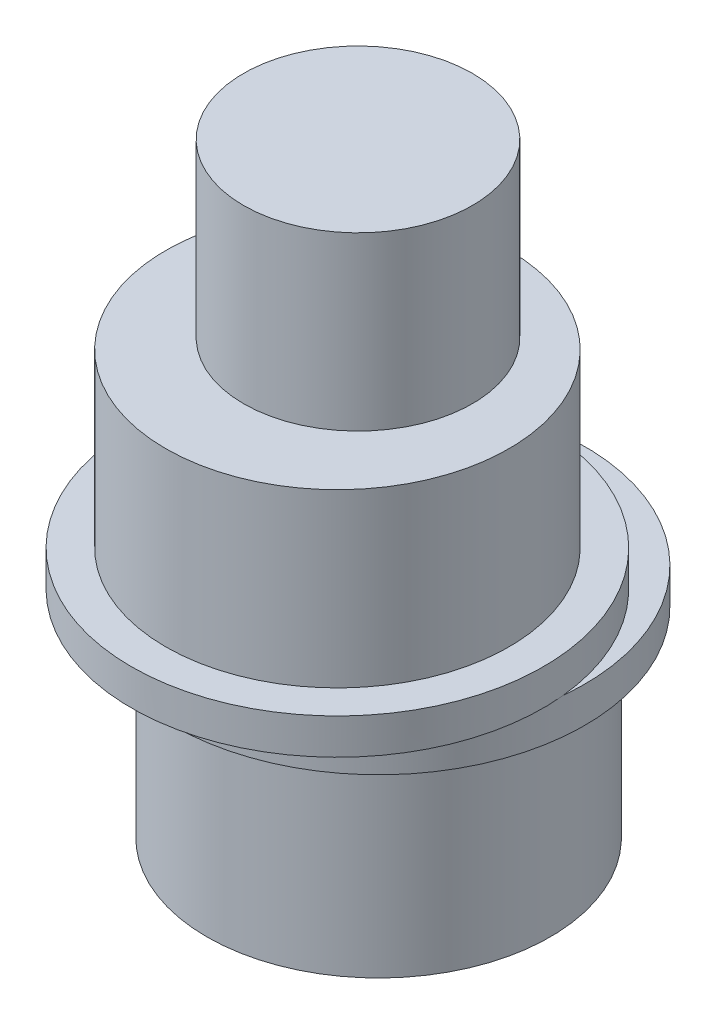
ISO-10303-21;
HEADER;
FILE_DESCRIPTION(('STEP AP214'),'2;1');
FILE_NAME('part.step','',(''),(''),'','','');
FILE_SCHEMA(('AUTOMOTIVE_DESIGN { 1 0 10303 214 1 1 1 1 }'));
ENDSEC;
DATA;
#1=APPLICATION_CONTEXT('core data for automotive mechanical design processes');
#2=APPLICATION_PROTOCOL_DEFINITION('international standard','automotive_design',2000,#1);
#3=PRODUCT_CONTEXT('',#1,'mechanical');
#4=PRODUCT('Part','Part','',(#3));
#5=PRODUCT_RELATED_PRODUCT_CATEGORY('part','',(#4));
#6=PRODUCT_DEFINITION_FORMATION('','',#4);
#7=PRODUCT_DEFINITION_CONTEXT('part definition',#1,'design');
#8=PRODUCT_DEFINITION('design','',#6,#7);
#9=PRODUCT_DEFINITION_SHAPE('','',#8);
#10=(LENGTH_UNIT() NAMED_UNIT(*) SI_UNIT(.MILLI.,.METRE.));
#11=(NAMED_UNIT(*) PLANE_ANGLE_UNIT() SI_UNIT($,.RADIAN.));
#12=(NAMED_UNIT(*) SI_UNIT($,.STERADIAN.) SOLID_ANGLE_UNIT());
#13=UNCERTAINTY_MEASURE_WITH_UNIT(LENGTH_MEASURE(1.E-05),#10,'distance_accuracy_value','');
#14=(GEOMETRIC_REPRESENTATION_CONTEXT(3) GLOBAL_UNCERTAINTY_ASSIGNED_CONTEXT((#13)) GLOBAL_UNIT_ASSIGNED_CONTEXT((#10,
#11,#12)) REPRESENTATION_CONTEXT('',''));
#15=CARTESIAN_POINT('',(0.,0.,0.));
#16=DIRECTION('',(0.,0.,1.));
#17=DIRECTION('',(1.,0.,0.));
#18=AXIS2_PLACEMENT_3D('',#15,#16,#17);
#19=CARTESIAN_POINT('',(0.,7.,-0.72));
#20=DIRECTION('',(0.,-1.,0.));
#21=DIRECTION('',(0.,0.,-1.));
#22=AXIS2_PLACEMENT_3D('',#19,#20,#21);
#23=CYLINDRICAL_SURFACE('',#22,6.);
#24=CARTESIAN_POINT('',(0.,7.,-0.72));
#25=DIRECTION('',(0.,1.,0.));
#26=DIRECTION('',(0.,0.,1.));
#27=AXIS2_PLACEMENT_3D('',#24,#25,#26);
#28=CIRCLE('',#27,6.);
#29=CARTESIAN_POINT('',(0.,7.,5.28));
#30=VERTEX_POINT('',#29);
#31=EDGE_CURVE('E108',#30,#30,#28,.T.);
#32=ORIENTED_EDGE('',*,*,#31,.F.);
#33=EDGE_LOOP('',(#32));
#34=FACE_BOUND('',#33,.T.);
#35=CARTESIAN_POINT('',(0.,0.,-0.72));
#36=DIRECTION('',(0.,1.,0.));
#37=DIRECTION('',(0.,0.,1.));
#38=AXIS2_PLACEMENT_3D('',#35,#36,#37);
#39=CIRCLE('',#38,6.);
#40=CARTESIAN_POINT('',(0.,0.,5.28));
#41=VERTEX_POINT('',#40);
#42=EDGE_CURVE('E121',#41,#41,#39,.T.);
#43=ORIENTED_EDGE('',*,*,#42,.T.);
#44=EDGE_LOOP('',(#43));
#45=FACE_BOUND('',#44,.T.);
#46=ADVANCED_FACE('F45',(#34,#45),#23,.T.);
#47=CARTESIAN_POINT('',(0.,0.,-0.72));
#48=DIRECTION('',(0.,1.,0.));
#49=DIRECTION('',(0.,0.,1.));
#50=AXIS2_PLACEMENT_3D('',#47,#48,#49);
#51=PLANE('',#50);
#52=DIRECTION('',(1.,0.,0.));
#53=VECTOR('',#52,1.);
#54=CARTESIAN_POINT('',(0.,0.,2.));
#55=LINE('',#54,#53);
#56=CARTESIAN_POINT('',(-1.5,0.,2.));
#57=VERTEX_POINT('',#56);
#58=CARTESIAN_POINT('',(1.5,0.,2.));
#59=VERTEX_POINT('',#58);
#60=EDGE_CURVE('E107',#57,#59,#55,.T.);
#61=ORIENTED_EDGE('',*,*,#60,.T.);
#62=CARTESIAN_POINT('',(0.,0.,0.));
#63=DIRECTION('',(0.,-1.,0.));
#64=DIRECTION('',(0.,0.,-1.));
#65=AXIS2_PLACEMENT_3D('',#62,#63,#64);
#66=CIRCLE('',#65,2.5);
#67=EDGE_CURVE('E48',#59,#57,#66,.F.);
#68=ORIENTED_EDGE('',*,*,#67,.T.);
#69=EDGE_LOOP('',(#61,#68));
#70=FACE_BOUND('',#69,.T.);
#71=ORIENTED_EDGE('',*,*,#42,.F.);
#72=EDGE_LOOP('',(#71));
#73=FACE_BOUND('',#72,.T.);
#74=ADVANCED_FACE('F134',(#70,#73),#51,.F.);
#75=CARTESIAN_POINT('',(0.,8.25,-0.72));
#76=DIRECTION('',(0.,-1.,0.));
#77=DIRECTION('',(0.,0.,-1.));
#78=AXIS2_PLACEMENT_3D('',#75,#76,#77);
#79=CYLINDRICAL_SURFACE('',#78,7.2);
#80=CARTESIAN_POINT('',(0.,8.25,-0.72));
#81=DIRECTION('',(0.,1.,0.));
#82=DIRECTION('',(0.,0.,1.));
#83=AXIS2_PLACEMENT_3D('',#80,#81,#82);
#84=CIRCLE('',#83,7.2);
#85=CARTESIAN_POINT('',(7.16390954716766,8.25,0.));
#86=VERTEX_POINT('',#85);
#87=CARTESIAN_POINT('',(-7.16390954716766,8.25,0.));
#88=VERTEX_POINT('',#87);
#89=EDGE_CURVE('E118',#86,#88,#84,.T.);
#90=ORIENTED_EDGE('',*,*,#89,.F.);
#91=EDGE_CURVE('E122',#88,#86,#84,.T.);
#92=ORIENTED_EDGE('',*,*,#91,.F.);
#93=EDGE_LOOP('',(#90,#92));
#94=FACE_BOUND('',#93,.T.);
#95=CARTESIAN_POINT('',(0.,7.,-0.72));
#96=DIRECTION('',(0.,1.,0.));
#97=DIRECTION('',(0.,0.,1.));
#98=AXIS2_PLACEMENT_3D('',#95,#96,#97);
#99=CIRCLE('',#98,7.2);
#100=CARTESIAN_POINT('',(0.,7.,6.48));
#101=VERTEX_POINT('',#100);
#102=EDGE_CURVE('E113',#101,#101,#99,.T.);
#103=ORIENTED_EDGE('',*,*,#102,.T.);
#104=EDGE_LOOP('',(#103));
#105=FACE_BOUND('',#104,.T.);
#106=ADVANCED_FACE('F137',(#94,#105),#79,.T.);
#107=CARTESIAN_POINT('',(0.,8.25,-0.72));
#108=DIRECTION('',(0.,1.,0.));
#109=DIRECTION('',(0.,0.,1.));
#110=AXIS2_PLACEMENT_3D('',#107,#108,#109);
#111=PLANE('',#110);
#112=CARTESIAN_POINT('',(0.,8.25,0.72));
#113=DIRECTION('',(0.,1.,0.));
#114=DIRECTION('',(0.,0.,1.));
#115=AXIS2_PLACEMENT_3D('',#112,#113,#114);
#116=CIRCLE('',#115,7.2);
#117=EDGE_CURVE('E114',#86,#88,#116,.T.);
#118=ORIENTED_EDGE('',*,*,#117,.F.);
#119=ORIENTED_EDGE('',*,*,#89,.T.);
#120=EDGE_LOOP('',(#118,#119));
#121=FACE_BOUND('',#120,.T.);
#122=ADVANCED_FACE('F150',(#121),#111,.T.);
#123=CARTESIAN_POINT('',(0.,7.,-0.72));
#124=DIRECTION('',(0.,1.,0.));
#125=DIRECTION('',(0.,0.,1.));
#126=AXIS2_PLACEMENT_3D('',#123,#124,#125);
#127=PLANE('',#126);
#128=ORIENTED_EDGE('',*,*,#31,.T.);
#129=EDGE_LOOP('',(#128));
#130=FACE_BOUND('',#129,.T.);
#131=ORIENTED_EDGE('',*,*,#102,.F.);
#132=EDGE_LOOP('',(#131));
#133=FACE_BOUND('',#132,.T.);
#134=ADVANCED_FACE('F147',(#130,#133),#127,.F.);
#135=CARTESIAN_POINT('',(0.,8.25,0.72));
#136=DIRECTION('',(0.,1.,0.));
#137=DIRECTION('',(0.,0.,1.));
#138=AXIS2_PLACEMENT_3D('',#135,#136,#137);
#139=PLANE('',#138);
#140=EDGE_CURVE('E102',#88,#86,#116,.T.);
#141=ORIENTED_EDGE('',*,*,#140,.F.);
#142=ORIENTED_EDGE('',*,*,#91,.T.);
#143=EDGE_LOOP('',(#141,#142));
#144=FACE_BOUND('',#143,.T.);
#145=ADVANCED_FACE('F149',(#144),#139,.F.);
#146=CARTESIAN_POINT('',(0.,9.5,0.72));
#147=DIRECTION('',(0.,-1.,0.));
#148=DIRECTION('',(0.,0.,-1.));
#149=AXIS2_PLACEMENT_3D('',#146,#147,#148);
#150=CYLINDRICAL_SURFACE('',#149,7.2);
#151=CARTESIAN_POINT('',(0.,9.5,0.72));
#152=DIRECTION('',(0.,1.,0.));
#153=DIRECTION('',(0.,0.,1.));
#154=AXIS2_PLACEMENT_3D('',#151,#152,#153);
#155=CIRCLE('',#154,7.2);
#156=CARTESIAN_POINT('',(0.,9.5,7.92));
#157=VERTEX_POINT('',#156);
#158=EDGE_CURVE('E109',#157,#157,#155,.T.);
#159=ORIENTED_EDGE('',*,*,#158,.F.);
#160=EDGE_LOOP('',(#159));
#161=FACE_BOUND('',#160,.T.);
#162=ORIENTED_EDGE('',*,*,#117,.T.);
#163=ORIENTED_EDGE('',*,*,#140,.T.);
#164=EDGE_LOOP('',(#162,#163));
#165=FACE_BOUND('',#164,.T.);
#166=ADVANCED_FACE('F164',(#161,#165),#150,.T.);
#167=CARTESIAN_POINT('',(0.,9.5,0.72));
#168=DIRECTION('',(0.,1.,0.));
#169=DIRECTION('',(0.,0.,1.));
#170=AXIS2_PLACEMENT_3D('',#167,#168,#169);
#171=PLANE('',#170);
#172=CARTESIAN_POINT('',(0.,9.5,0.72));
#173=DIRECTION('',(0.,1.,0.));
#174=DIRECTION('',(0.,0.,1.));
#175=AXIS2_PLACEMENT_3D('',#172,#173,#174);
#176=CIRCLE('',#175,6.);
#177=CARTESIAN_POINT('',(0.,9.5,6.72));
#178=VERTEX_POINT('',#177);
#179=EDGE_CURVE('E103',#178,#178,#176,.T.);
#180=ORIENTED_EDGE('',*,*,#179,.F.);
#181=EDGE_LOOP('',(#180));
#182=FACE_BOUND('',#181,.T.);
#183=ORIENTED_EDGE('',*,*,#158,.T.);
#184=EDGE_LOOP('',(#183));
#185=FACE_BOUND('',#184,.T.);
#186=ADVANCED_FACE('F167',(#182,#185),#171,.T.);
#187=CARTESIAN_POINT('',(0.,15.5,0.72));
#188=DIRECTION('',(0.,-1.,0.));
#189=DIRECTION('',(0.,0.,-1.));
#190=AXIS2_PLACEMENT_3D('',#187,#188,#189);
#191=CYLINDRICAL_SURFACE('',#190,6.);
#192=CARTESIAN_POINT('',(0.,15.5,0.72));
#193=DIRECTION('',(0.,1.,0.));
#194=DIRECTION('',(0.,0.,1.));
#195=AXIS2_PLACEMENT_3D('',#192,#193,#194);
#196=CIRCLE('',#195,6.);
#197=CARTESIAN_POINT('',(0.,15.5,6.72));
#198=VERTEX_POINT('',#197);
#199=EDGE_CURVE('E98',#198,#198,#196,.T.);
#200=ORIENTED_EDGE('',*,*,#199,.F.);
#201=EDGE_LOOP('',(#200));
#202=FACE_BOUND('',#201,.T.);
#203=ORIENTED_EDGE('',*,*,#179,.T.);
#204=EDGE_LOOP('',(#203));
#205=FACE_BOUND('',#204,.T.);
#206=ADVANCED_FACE('F174',(#202,#205),#191,.T.);
#207=CARTESIAN_POINT('',(0.,15.5,0.72));
#208=DIRECTION('',(0.,1.,0.));
#209=DIRECTION('',(0.,0.,1.));
#210=AXIS2_PLACEMENT_3D('',#207,#208,#209);
#211=PLANE('',#210);
#212=CARTESIAN_POINT('',(0.,15.5,0.));
#213=DIRECTION('',(0.,1.,0.));
#214=DIRECTION('',(0.,0.,1.));
#215=AXIS2_PLACEMENT_3D('',#212,#213,#214);
#216=CIRCLE('',#215,4.);
#217=CARTESIAN_POINT('',(0.,15.5,4.));
#218=VERTEX_POINT('',#217);
#219=EDGE_CURVE('E11',#218,#218,#216,.T.);
#220=ORIENTED_EDGE('',*,*,#219,.F.);
#221=EDGE_LOOP('',(#220));
#222=FACE_BOUND('',#221,.T.);
#223=ORIENTED_EDGE('',*,*,#199,.T.);
#224=EDGE_LOOP('',(#223));
#225=FACE_BOUND('',#224,.T.);
#226=ADVANCED_FACE('F178',(#222,#225),#211,.T.);
#227=CARTESIAN_POINT('',(0.,11.,0.));
#228=DIRECTION('',(0.,-1.,0.));
#229=DIRECTION('',(0.,0.,-1.));
#230=AXIS2_PLACEMENT_3D('',#227,#228,#229);
#231=CYLINDRICAL_SURFACE('',#230,2.5);
#232=DIRECTION('',(0.,-1.,0.));
#233=VECTOR('',#232,1.);
#234=CARTESIAN_POINT('',(1.5,11.,2.));
#235=LINE('',#234,#233);
#236=CARTESIAN_POINT('',(1.5,11.,2.));
#237=VERTEX_POINT('',#236);
#238=EDGE_CURVE('E62',#237,#59,#235,.T.);
#239=ORIENTED_EDGE('',*,*,#238,.F.);
#240=CARTESIAN_POINT('',(0.,11.,0.));
#241=DIRECTION('',(0.,-1.,0.));
#242=DIRECTION('',(0.,0.,-1.));
#243=AXIS2_PLACEMENT_3D('',#240,#241,#242);
#244=CIRCLE('',#243,2.5);
#245=CARTESIAN_POINT('',(-1.5,11.,2.));
#246=VERTEX_POINT('',#245);
#247=EDGE_CURVE('E79',#246,#237,#244,.T.);
#248=ORIENTED_EDGE('',*,*,#247,.F.);
#249=DIRECTION('',(0.,-1.,0.));
#250=VECTOR('',#249,1.);
#251=CARTESIAN_POINT('',(-1.5,11.,2.));
#252=LINE('',#251,#250);
#253=EDGE_CURVE('E84',#246,#57,#252,.T.);
#254=ORIENTED_EDGE('',*,*,#253,.T.);
#255=ORIENTED_EDGE('',*,*,#67,.F.);
#256=EDGE_LOOP('',(#239,#248,#254,#255));
#257=FACE_BOUND('',#256,.T.);
#258=ADVANCED_FACE('F77',(#257),#231,.F.);
#259=CARTESIAN_POINT('',(1.5,11.,2.));
#260=DIRECTION('',(0.,0.,1.));
#261=DIRECTION('',(1.,0.,0.));
#262=AXIS2_PLACEMENT_3D('',#259,#260,#261);
#263=PLANE('',#262);
#264=ORIENTED_EDGE('',*,*,#253,.F.);
#265=DIRECTION('',(-1.,0.,0.));
#266=VECTOR('',#265,1.);
#267=CARTESIAN_POINT('',(1.5,11.,2.));
#268=LINE('',#267,#266);
#269=EDGE_CURVE('E85',#237,#246,#268,.T.);
#270=ORIENTED_EDGE('',*,*,#269,.F.);
#271=ORIENTED_EDGE('',*,*,#238,.T.);
#272=ORIENTED_EDGE('',*,*,#60,.F.);
#273=EDGE_LOOP('',(#264,#270,#271,#272));
#274=FACE_BOUND('',#273,.T.);
#275=ADVANCED_FACE('F92',(#274),#263,.F.);
#276=CARTESIAN_POINT('',(0.,11.,0.));
#277=DIRECTION('',(0.,-1.,0.));
#278=DIRECTION('',(0.,0.,-1.));
#279=AXIS2_PLACEMENT_3D('',#276,#277,#278);
#280=PLANE('',#279);
#281=ORIENTED_EDGE('',*,*,#247,.T.);
#282=ORIENTED_EDGE('',*,*,#269,.T.);
#283=EDGE_LOOP('',(#281,#282));
#284=FACE_BOUND('',#283,.T.);
#285=ADVANCED_FACE('F88',(#284),#280,.T.);
#286=CARTESIAN_POINT('',(0.,21.5,0.));
#287=DIRECTION('',(0.,-1.,0.));
#288=DIRECTION('',(0.,0.,-1.));
#289=AXIS2_PLACEMENT_3D('',#286,#287,#288);
#290=CYLINDRICAL_SURFACE('',#289,4.);
#291=CARTESIAN_POINT('',(0.,21.5,0.));
#292=DIRECTION('',(0.,1.,0.));
#293=DIRECTION('',(0.,0.,1.));
#294=AXIS2_PLACEMENT_3D('',#291,#292,#293);
#295=CIRCLE('',#294,4.);
#296=CARTESIAN_POINT('',(0.,21.5,4.));
#297=VERTEX_POINT('',#296);
#298=EDGE_CURVE('E90',#297,#297,#295,.T.);
#299=ORIENTED_EDGE('',*,*,#298,.F.);
#300=EDGE_LOOP('',(#299));
#301=FACE_BOUND('',#300,.T.);
#302=ORIENTED_EDGE('',*,*,#219,.T.);
#303=EDGE_LOOP('',(#302));
#304=FACE_BOUND('',#303,.T.);
#305=ADVANCED_FACE('F189',(#301,#304),#290,.T.);
#306=CARTESIAN_POINT('',(0.,21.5,0.));
#307=DIRECTION('',(0.,1.,0.));
#308=DIRECTION('',(0.,0.,1.));
#309=AXIS2_PLACEMENT_3D('',#306,#307,#308);
#310=PLANE('',#309);
#311=ORIENTED_EDGE('',*,*,#298,.T.);
#312=EDGE_LOOP('',(#311));
#313=FACE_BOUND('',#312,.T.);
#314=ADVANCED_FACE('F192',(#313),#310,.T.);
#315=CLOSED_SHELL('',(#46,#74,#106,#122,#134,#145,#166,#186,#206,#226,#258,#275,#285,#305,#314));
#316=MANIFOLD_SOLID_BREP('B2',#315);
#317=ADVANCED_BREP_SHAPE_REPRESENTATION('',(#18,#316),#14);
#318=SHAPE_DEFINITION_REPRESENTATION(#9,#317);
ENDSEC;
END-ISO-10303-21;
